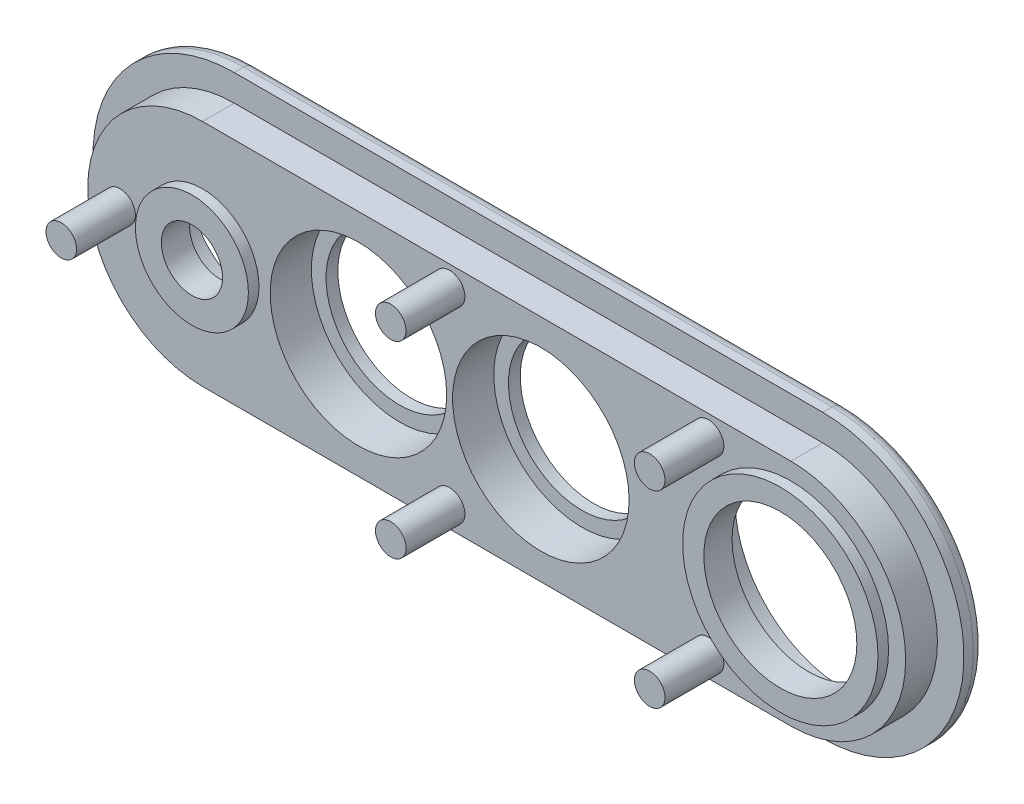
ISO-10303-21;
HEADER;
FILE_DESCRIPTION(('STEP AP214'),'2;1');
FILE_NAME('part.step','',(''),(''),'','','');
FILE_SCHEMA(('AUTOMOTIVE_DESIGN { 1 0 10303 214 1 1 1 1 }'));
ENDSEC;
DATA;
#1=APPLICATION_CONTEXT('core data for automotive mechanical design processes');
#2=APPLICATION_PROTOCOL_DEFINITION('international standard','automotive_design',2000,#1);
#3=PRODUCT_CONTEXT('',#1,'mechanical');
#4=PRODUCT('Part','Part','',(#3));
#5=PRODUCT_RELATED_PRODUCT_CATEGORY('part','',(#4));
#6=PRODUCT_DEFINITION_FORMATION('','',#4);
#7=PRODUCT_DEFINITION_CONTEXT('part definition',#1,'design');
#8=PRODUCT_DEFINITION('design','',#6,#7);
#9=PRODUCT_DEFINITION_SHAPE('','',#8);
#10=(LENGTH_UNIT() NAMED_UNIT(*) SI_UNIT(.MILLI.,.METRE.));
#11=(NAMED_UNIT(*) PLANE_ANGLE_UNIT() SI_UNIT($,.RADIAN.));
#12=(NAMED_UNIT(*) SI_UNIT($,.STERADIAN.) SOLID_ANGLE_UNIT());
#13=UNCERTAINTY_MEASURE_WITH_UNIT(LENGTH_MEASURE(1.E-05),#10,'distance_accuracy_value','');
#14=(GEOMETRIC_REPRESENTATION_CONTEXT(3) GLOBAL_UNCERTAINTY_ASSIGNED_CONTEXT((#13)) GLOBAL_UNIT_ASSIGNED_CONTEXT((#10,
#11,#12)) REPRESENTATION_CONTEXT('',''));
#15=CARTESIAN_POINT('',(0.,0.,0.));
#16=DIRECTION('',(0.,0.,1.));
#17=DIRECTION('',(1.,0.,0.));
#18=AXIS2_PLACEMENT_3D('',#15,#16,#17);
#19=CARTESIAN_POINT('',(0.,-12.,4.5));
#20=DIRECTION('',(0.,0.,1.));
#21=DIRECTION('',(1.,0.,0.));
#22=AXIS2_PLACEMENT_3D('',#19,#20,#21);
#23=PLANE('',#22);
#24=CARTESIAN_POINT('',(0.,-12.,4.5));
#25=DIRECTION('',(0.,0.,1.));
#26=DIRECTION('',(1.,0.,0.));
#27=AXIS2_PLACEMENT_3D('',#24,#25,#26);
#28=CIRCLE('',#27,4.8);
#29=CARTESIAN_POINT('',(4.8,-12.,4.5));
#30=VERTEX_POINT('',#29);
#31=EDGE_CURVE('E390',#30,#30,#28,.T.);
#32=ORIENTED_EDGE('',*,*,#31,.F.);
#33=EDGE_LOOP('',(#32));
#34=FACE_BOUND('',#33,.T.);
#35=CARTESIAN_POINT('',(43.,-20.,4.5));
#36=DIRECTION('',(0.,0.,1.));
#37=DIRECTION('',(1.,0.,0.));
#38=AXIS2_PLACEMENT_3D('',#35,#36,#37);
#39=CIRCLE('',#38,1.3);
#40=CARTESIAN_POINT('',(44.3,-20.,4.5));
#41=VERTEX_POINT('',#40);
#42=EDGE_CURVE('E404',#41,#41,#39,.T.);
#43=ORIENTED_EDGE('',*,*,#42,.F.);
#44=EDGE_LOOP('',(#43));
#45=FACE_BOUND('',#44,.T.);
#46=CARTESIAN_POINT('',(43.,-4.,4.5));
#47=DIRECTION('',(0.,0.,1.));
#48=DIRECTION('',(1.,0.,0.));
#49=AXIS2_PLACEMENT_3D('',#46,#47,#48);
#50=CIRCLE('',#49,1.3);
#51=CARTESIAN_POINT('',(44.3,-4.,4.5));
#52=VERTEX_POINT('',#51);
#53=EDGE_CURVE('E410',#52,#52,#50,.T.);
#54=ORIENTED_EDGE('',*,*,#53,.F.);
#55=EDGE_LOOP('',(#54));
#56=FACE_BOUND('',#55,.T.);
#57=CARTESIAN_POINT('',(-7.,-12.,4.5));
#58=DIRECTION('',(0.,0.,1.));
#59=DIRECTION('',(1.,0.,0.));
#60=AXIS2_PLACEMENT_3D('',#57,#58,#59);
#61=CIRCLE('',#60,1.3);
#62=CARTESIAN_POINT('',(-5.7,-12.,4.5));
#63=VERTEX_POINT('',#62);
#64=EDGE_CURVE('E416',#63,#63,#61,.T.);
#65=ORIENTED_EDGE('',*,*,#64,.F.);
#66=EDGE_LOOP('',(#65));
#67=FACE_BOUND('',#66,.T.);
#68=CARTESIAN_POINT('',(21.,-20.,4.5));
#69=DIRECTION('',(0.,0.,1.));
#70=DIRECTION('',(1.,0.,0.));
#71=AXIS2_PLACEMENT_3D('',#68,#69,#70);
#72=CIRCLE('',#71,1.3);
#73=CARTESIAN_POINT('',(22.3,-20.,4.5));
#74=VERTEX_POINT('',#73);
#75=EDGE_CURVE('E422',#74,#74,#72,.T.);
#76=ORIENTED_EDGE('',*,*,#75,.F.);
#77=EDGE_LOOP('',(#76));
#78=FACE_BOUND('',#77,.T.);
#79=CARTESIAN_POINT('',(21.,-4.,4.5));
#80=DIRECTION('',(0.,0.,1.));
#81=DIRECTION('',(1.,0.,0.));
#82=AXIS2_PLACEMENT_3D('',#79,#80,#81);
#83=CIRCLE('',#82,1.3);
#84=CARTESIAN_POINT('',(22.3,-4.,4.5));
#85=VERTEX_POINT('',#84);
#86=EDGE_CURVE('E230',#85,#85,#83,.T.);
#87=ORIENTED_EDGE('',*,*,#86,.F.);
#88=EDGE_LOOP('',(#87));
#89=FACE_BOUND('',#88,.T.);
#90=CARTESIAN_POINT('',(28.75,-12.,4.5));
#91=DIRECTION('',(0.,0.,1.));
#92=DIRECTION('',(1.,0.,0.));
#93=AXIS2_PLACEMENT_3D('',#90,#91,#92);
#94=CIRCLE('',#93,7.5);
#95=CARTESIAN_POINT('',(36.25,-12.,4.5));
#96=VERTEX_POINT('',#95);
#97=EDGE_CURVE('E222',#96,#96,#94,.T.);
#98=ORIENTED_EDGE('',*,*,#97,.F.);
#99=EDGE_LOOP('',(#98));
#100=FACE_BOUND('',#99,.T.);
#101=CARTESIAN_POINT('',(13.25,-12.,4.5));
#102=DIRECTION('',(0.,0.,1.));
#103=DIRECTION('',(1.,0.,0.));
#104=AXIS2_PLACEMENT_3D('',#101,#102,#103);
#105=CIRCLE('',#104,7.5);
#106=CARTESIAN_POINT('',(20.75,-12.,4.5));
#107=VERTEX_POINT('',#106);
#108=EDGE_CURVE('E227',#107,#107,#105,.T.);
#109=ORIENTED_EDGE('',*,*,#108,.F.);
#110=EDGE_LOOP('',(#109));
#111=FACE_BOUND('',#110,.T.);
#112=DIRECTION('',(-1.,0.,0.));
#113=VECTOR('',#112,1.);
#114=CARTESIAN_POINT('',(0.,-2.25,4.5));
#115=LINE('',#114,#113);
#116=CARTESIAN_POINT('',(50.,-2.25,4.5));
#117=VERTEX_POINT('',#116);
#118=CARTESIAN_POINT('',(0.,-2.25,4.5));
#119=VERTEX_POINT('',#118);
#120=EDGE_CURVE('E145',#117,#119,#115,.T.);
#121=ORIENTED_EDGE('',*,*,#120,.T.);
#122=CARTESIAN_POINT('',(0.,-12.,4.5));
#123=DIRECTION('',(0.,0.,1.));
#124=DIRECTION('',(1.,0.,0.));
#125=AXIS2_PLACEMENT_3D('',#122,#123,#124);
#126=CIRCLE('',#125,9.75);
#127=CARTESIAN_POINT('',(0.,-21.75,4.5));
#128=VERTEX_POINT('',#127);
#129=EDGE_CURVE('E156',#119,#128,#126,.T.);
#130=ORIENTED_EDGE('',*,*,#129,.T.);
#131=DIRECTION('',(1.,0.,0.));
#132=VECTOR('',#131,1.);
#133=CARTESIAN_POINT('',(0.,-21.75,4.5));
#134=LINE('',#133,#132);
#135=CARTESIAN_POINT('',(50.,-21.75,4.5));
#136=VERTEX_POINT('',#135);
#137=EDGE_CURVE('E124',#128,#136,#134,.T.);
#138=ORIENTED_EDGE('',*,*,#137,.T.);
#139=CARTESIAN_POINT('',(50.,-12.,4.5));
#140=DIRECTION('',(0.,0.,1.));
#141=DIRECTION('',(1.,0.,0.));
#142=AXIS2_PLACEMENT_3D('',#139,#140,#141);
#143=CIRCLE('',#142,9.75);
#144=EDGE_CURVE('E148',#136,#117,#143,.T.);
#145=ORIENTED_EDGE('',*,*,#144,.T.);
#146=EDGE_LOOP('',(#121,#130,#138,#145));
#147=FACE_BOUND('',#146,.T.);
#148=CARTESIAN_POINT('',(50.,-12.,4.5));
#149=DIRECTION('',(0.,0.,1.));
#150=DIRECTION('',(1.,0.,0.));
#151=AXIS2_PLACEMENT_3D('',#148,#149,#150);
#152=CIRCLE('',#151,8.3);
#153=CARTESIAN_POINT('',(58.3,-12.,4.5));
#154=VERTEX_POINT('',#153);
#155=EDGE_CURVE('E397',#154,#154,#152,.T.);
#156=ORIENTED_EDGE('',*,*,#155,.F.);
#157=EDGE_LOOP('',(#156));
#158=FACE_BOUND('',#157,.T.);
#159=ADVANCED_FACE('F39',(#34,#45,#56,#67,#78,#89,#100,#111,#147,#158),#23,.T.);
#160=CARTESIAN_POINT('',(13.25,-12.,0.));
#161=DIRECTION('',(0.,0.,1.));
#162=DIRECTION('',(1.,0.,0.));
#163=AXIS2_PLACEMENT_3D('',#160,#161,#162);
#164=CYLINDRICAL_SURFACE('',#163,6.25);
#165=CARTESIAN_POINT('',(13.25,-12.,0.));
#166=DIRECTION('',(0.,0.,1.));
#167=DIRECTION('',(1.,0.,0.));
#168=AXIS2_PLACEMENT_3D('',#165,#166,#167);
#169=CIRCLE('',#168,6.25);
#170=CARTESIAN_POINT('',(19.5,-12.,0.));
#171=VERTEX_POINT('',#170);
#172=EDGE_CURVE('E151',#171,#171,#169,.T.);
#173=ORIENTED_EDGE('',*,*,#172,.F.);
#174=EDGE_LOOP('',(#173));
#175=FACE_BOUND('',#174,.T.);
#176=CARTESIAN_POINT('',(13.25,-12.,1.));
#177=DIRECTION('',(0.,0.,1.));
#178=DIRECTION('',(1.,0.,0.));
#179=AXIS2_PLACEMENT_3D('',#176,#177,#178);
#180=CIRCLE('',#179,6.25);
#181=CARTESIAN_POINT('',(19.5,-12.,1.));
#182=VERTEX_POINT('',#181);
#183=EDGE_CURVE('E43',#182,#182,#180,.F.);
#184=ORIENTED_EDGE('',*,*,#183,.F.);
#185=EDGE_LOOP('',(#184));
#186=FACE_BOUND('',#185,.T.);
#187=ADVANCED_FACE('F256',(#175,#186),#164,.F.);
#188=CARTESIAN_POINT('',(28.75,-12.,0.));
#189=DIRECTION('',(0.,0.,1.));
#190=DIRECTION('',(1.,0.,0.));
#191=AXIS2_PLACEMENT_3D('',#188,#189,#190);
#192=CYLINDRICAL_SURFACE('',#191,6.25);
#193=CARTESIAN_POINT('',(28.75,-12.,0.));
#194=DIRECTION('',(0.,0.,1.));
#195=DIRECTION('',(1.,0.,0.));
#196=AXIS2_PLACEMENT_3D('',#193,#194,#195);
#197=CIRCLE('',#196,6.25);
#198=CARTESIAN_POINT('',(35.,-12.,0.));
#199=VERTEX_POINT('',#198);
#200=EDGE_CURVE('E190',#199,#199,#197,.T.);
#201=ORIENTED_EDGE('',*,*,#200,.F.);
#202=EDGE_LOOP('',(#201));
#203=FACE_BOUND('',#202,.T.);
#204=CARTESIAN_POINT('',(28.75,-12.,1.));
#205=DIRECTION('',(0.,0.,1.));
#206=DIRECTION('',(1.,0.,0.));
#207=AXIS2_PLACEMENT_3D('',#204,#205,#206);
#208=CIRCLE('',#207,6.25);
#209=CARTESIAN_POINT('',(35.,-12.,1.));
#210=VERTEX_POINT('',#209);
#211=EDGE_CURVE('E215',#210,#210,#208,.F.);
#212=ORIENTED_EDGE('',*,*,#211,.F.);
#213=EDGE_LOOP('',(#212));
#214=FACE_BOUND('',#213,.T.);
#215=ADVANCED_FACE('F259',(#203,#214),#192,.F.);
#216=CARTESIAN_POINT('',(50.,-12.,0.));
#217=DIRECTION('',(0.,0.,1.));
#218=DIRECTION('',(1.,0.,0.));
#219=AXIS2_PLACEMENT_3D('',#216,#217,#218);
#220=CYLINDRICAL_SURFACE('',#219,6.5);
#221=CARTESIAN_POINT('',(50.,-12.,3.));
#222=DIRECTION('',(0.,0.,-1.));
#223=DIRECTION('',(-1.,0.,0.));
#224=AXIS2_PLACEMENT_3D('',#221,#222,#223);
#225=CIRCLE('',#224,6.5);
#226=CARTESIAN_POINT('',(43.5,-12.,3.));
#227=VERTEX_POINT('',#226);
#228=EDGE_CURVE('E186',#227,#227,#225,.F.);
#229=ORIENTED_EDGE('',*,*,#228,.F.);
#230=EDGE_LOOP('',(#229));
#231=FACE_BOUND('',#230,.T.);
#232=CARTESIAN_POINT('',(50.,-12.,5.4));
#233=DIRECTION('',(0.,0.,1.));
#234=DIRECTION('',(1.,0.,0.));
#235=AXIS2_PLACEMENT_3D('',#232,#233,#234);
#236=CIRCLE('',#235,6.5);
#237=CARTESIAN_POINT('',(56.5,-12.,5.4));
#238=VERTEX_POINT('',#237);
#239=EDGE_CURVE('E391',#238,#238,#236,.T.);
#240=ORIENTED_EDGE('',*,*,#239,.T.);
#241=EDGE_LOOP('',(#240));
#242=FACE_BOUND('',#241,.T.);
#243=ADVANCED_FACE('F358',(#231,#242),#220,.F.);
#244=CARTESIAN_POINT('',(0.,-12.,0.));
#245=DIRECTION('',(0.,0.,1.));
#246=DIRECTION('',(1.,0.,0.));
#247=AXIS2_PLACEMENT_3D('',#244,#245,#246);
#248=CYLINDRICAL_SURFACE('',#247,2.6);
#249=CARTESIAN_POINT('',(0.,-12.,3.));
#250=DIRECTION('',(0.,0.,-1.));
#251=DIRECTION('',(-1.,0.,0.));
#252=AXIS2_PLACEMENT_3D('',#249,#250,#251);
#253=CIRCLE('',#252,2.6);
#254=CARTESIAN_POINT('',(-2.6,-12.,3.));
#255=VERTEX_POINT('',#254);
#256=EDGE_CURVE('E183',#255,#255,#253,.F.);
#257=ORIENTED_EDGE('',*,*,#256,.F.);
#258=EDGE_LOOP('',(#257));
#259=FACE_BOUND('',#258,.T.);
#260=CARTESIAN_POINT('',(0.,-12.,5.4));
#261=DIRECTION('',(0.,0.,1.));
#262=DIRECTION('',(1.,0.,0.));
#263=AXIS2_PLACEMENT_3D('',#260,#261,#262);
#264=CIRCLE('',#263,2.6);
#265=CARTESIAN_POINT('',(2.6,-12.,5.4));
#266=VERTEX_POINT('',#265);
#267=EDGE_CURVE('E388',#266,#266,#264,.T.);
#268=ORIENTED_EDGE('',*,*,#267,.T.);
#269=EDGE_LOOP('',(#268));
#270=FACE_BOUND('',#269,.T.);
#271=ADVANCED_FACE('F307',(#259,#270),#248,.F.);
#272=CARTESIAN_POINT('',(0.,-12.,4.5));
#273=DIRECTION('',(0.,0.,-1.));
#274=DIRECTION('',(-1.,0.,0.));
#275=AXIS2_PLACEMENT_3D('',#272,#273,#274);
#276=CYLINDRICAL_SURFACE('',#275,12.);
#277=DIRECTION('',(0.,0.,-1.));
#278=VECTOR('',#277,1.);
#279=CARTESIAN_POINT('',(0.,0.,4.5));
#280=LINE('',#279,#278);
#281=CARTESIAN_POINT('',(0.,0.,1.8));
#282=VERTEX_POINT('',#281);
#283=CARTESIAN_POINT('',(0.,0.,1.));
#284=VERTEX_POINT('',#283);
#285=EDGE_CURVE('E171',#282,#284,#280,.T.);
#286=ORIENTED_EDGE('',*,*,#285,.T.);
#287=CARTESIAN_POINT('',(0.,-12.,1.));
#288=DIRECTION('',(0.,0.,1.));
#289=DIRECTION('',(1.,0.,0.));
#290=AXIS2_PLACEMENT_3D('',#287,#288,#289);
#291=CIRCLE('',#290,12.);
#292=CARTESIAN_POINT('',(0.,-24.,1.));
#293=VERTEX_POINT('',#292);
#294=EDGE_CURVE('E48',#284,#293,#291,.T.);
#295=ORIENTED_EDGE('',*,*,#294,.T.);
#296=DIRECTION('',(0.,0.,-1.));
#297=VECTOR('',#296,1.);
#298=CARTESIAN_POINT('',(0.,-24.,4.5));
#299=LINE('',#298,#297);
#300=CARTESIAN_POINT('',(0.,-24.,1.8));
#301=VERTEX_POINT('',#300);
#302=EDGE_CURVE('E178',#301,#293,#299,.T.);
#303=ORIENTED_EDGE('',*,*,#302,.F.);
#304=CARTESIAN_POINT('',(0.,-12.,1.8));
#305=DIRECTION('',(0.,0.,1.));
#306=DIRECTION('',(1.,0.,0.));
#307=AXIS2_PLACEMENT_3D('',#304,#305,#306);
#308=CIRCLE('',#307,12.);
#309=EDGE_CURVE('E169',#282,#301,#308,.T.);
#310=ORIENTED_EDGE('',*,*,#309,.F.);
#311=EDGE_LOOP('',(#286,#295,#303,#310));
#312=FACE_BOUND('',#311,.T.);
#313=ADVANCED_FACE('F303',(#312),#276,.T.);
#314=CARTESIAN_POINT('',(0.,-24.,4.5));
#315=DIRECTION('',(0.,1.,0.));
#316=DIRECTION('',(0.,0.,1.));
#317=AXIS2_PLACEMENT_3D('',#314,#315,#316);
#318=PLANE('',#317);
#319=ORIENTED_EDGE('',*,*,#302,.T.);
#320=DIRECTION('',(1.,0.,0.));
#321=VECTOR('',#320,1.);
#322=CARTESIAN_POINT('',(0.,-24.,1.));
#323=LINE('',#322,#321);
#324=CARTESIAN_POINT('',(50.,-24.,1.));
#325=VERTEX_POINT('',#324);
#326=EDGE_CURVE('E202',#293,#325,#323,.T.);
#327=ORIENTED_EDGE('',*,*,#326,.T.);
#328=DIRECTION('',(0.,0.,-1.));
#329=VECTOR('',#328,1.);
#330=CARTESIAN_POINT('',(50.,-24.,4.5));
#331=LINE('',#330,#329);
#332=CARTESIAN_POINT('',(50.,-24.,1.8));
#333=VERTEX_POINT('',#332);
#334=EDGE_CURVE('E175',#333,#325,#331,.T.);
#335=ORIENTED_EDGE('',*,*,#334,.F.);
#336=DIRECTION('',(1.,0.,0.));
#337=VECTOR('',#336,1.);
#338=CARTESIAN_POINT('',(0.,-24.,1.8));
#339=LINE('',#338,#337);
#340=EDGE_CURVE('E167',#301,#333,#339,.T.);
#341=ORIENTED_EDGE('',*,*,#340,.F.);
#342=EDGE_LOOP('',(#319,#327,#335,#341));
#343=FACE_BOUND('',#342,.T.);
#344=ADVANCED_FACE('F299',(#343),#318,.F.);
#345=CARTESIAN_POINT('',(50.,-12.,4.5));
#346=DIRECTION('',(0.,0.,-1.));
#347=DIRECTION('',(-1.,0.,0.));
#348=AXIS2_PLACEMENT_3D('',#345,#346,#347);
#349=CYLINDRICAL_SURFACE('',#348,12.);
#350=ORIENTED_EDGE('',*,*,#334,.T.);
#351=CARTESIAN_POINT('',(50.,-12.,1.));
#352=DIRECTION('',(0.,0.,1.));
#353=DIRECTION('',(1.,0.,0.));
#354=AXIS2_PLACEMENT_3D('',#351,#352,#353);
#355=CIRCLE('',#354,12.);
#356=CARTESIAN_POINT('',(50.,0.,1.));
#357=VERTEX_POINT('',#356);
#358=EDGE_CURVE('E182',#325,#357,#355,.T.);
#359=ORIENTED_EDGE('',*,*,#358,.T.);
#360=DIRECTION('',(0.,0.,-1.));
#361=VECTOR('',#360,1.);
#362=CARTESIAN_POINT('',(50.,0.,4.5));
#363=LINE('',#362,#361);
#364=CARTESIAN_POINT('',(50.,0.,1.8));
#365=VERTEX_POINT('',#364);
#366=EDGE_CURVE('E173',#365,#357,#363,.T.);
#367=ORIENTED_EDGE('',*,*,#366,.F.);
#368=CARTESIAN_POINT('',(50.,-12.,1.8));
#369=DIRECTION('',(0.,0.,1.));
#370=DIRECTION('',(1.,0.,0.));
#371=AXIS2_PLACEMENT_3D('',#368,#369,#370);
#372=CIRCLE('',#371,12.);
#373=EDGE_CURVE('E162',#333,#365,#372,.T.);
#374=ORIENTED_EDGE('',*,*,#373,.F.);
#375=EDGE_LOOP('',(#350,#359,#367,#374));
#376=FACE_BOUND('',#375,.T.);
#377=ADVANCED_FACE('F296',(#376),#349,.T.);
#378=CARTESIAN_POINT('',(0.,0.,4.5));
#379=DIRECTION('',(0.,-1.,0.));
#380=DIRECTION('',(0.,0.,-1.));
#381=AXIS2_PLACEMENT_3D('',#378,#379,#380);
#382=PLANE('',#381);
#383=ORIENTED_EDGE('',*,*,#366,.T.);
#384=DIRECTION('',(-1.,0.,0.));
#385=VECTOR('',#384,1.);
#386=CARTESIAN_POINT('',(0.,0.,1.));
#387=LINE('',#386,#385);
#388=EDGE_CURVE('E11',#357,#284,#387,.T.);
#389=ORIENTED_EDGE('',*,*,#388,.T.);
#390=ORIENTED_EDGE('',*,*,#285,.F.);
#391=DIRECTION('',(-1.,0.,0.));
#392=VECTOR('',#391,1.);
#393=CARTESIAN_POINT('',(0.,0.,1.8));
#394=LINE('',#393,#392);
#395=EDGE_CURVE('E180',#365,#282,#394,.T.);
#396=ORIENTED_EDGE('',*,*,#395,.F.);
#397=EDGE_LOOP('',(#383,#389,#390,#396));
#398=FACE_BOUND('',#397,.T.);
#399=ADVANCED_FACE('F292',(#398),#382,.F.);
#400=CARTESIAN_POINT('',(0.,-12.,0.));
#401=DIRECTION('',(0.,0.,1.));
#402=DIRECTION('',(1.,0.,0.));
#403=AXIS2_PLACEMENT_3D('',#400,#401,#402);
#404=PLANE('',#403);
#405=DIRECTION('',(-1.,0.,0.));
#406=VECTOR('',#405,1.);
#407=CARTESIAN_POINT('',(0.,-1.,0.));
#408=LINE('',#407,#406);
#409=CARTESIAN_POINT('',(0.,-1.,0.));
#410=VERTEX_POINT('',#409);
#411=CARTESIAN_POINT('',(50.,-1.,0.));
#412=VERTEX_POINT('',#411);
#413=EDGE_CURVE('E193',#410,#412,#408,.F.);
#414=ORIENTED_EDGE('',*,*,#413,.T.);
#415=CARTESIAN_POINT('',(50.,-12.,0.));
#416=DIRECTION('',(0.,0.,1.));
#417=DIRECTION('',(1.,0.,0.));
#418=AXIS2_PLACEMENT_3D('',#415,#416,#417);
#419=CIRCLE('',#418,11.);
#420=CARTESIAN_POINT('',(50.,-23.,0.));
#421=VERTEX_POINT('',#420);
#422=EDGE_CURVE('E199',#412,#421,#419,.F.);
#423=ORIENTED_EDGE('',*,*,#422,.T.);
#424=DIRECTION('',(1.,0.,0.));
#425=VECTOR('',#424,1.);
#426=CARTESIAN_POINT('',(0.,-23.,0.));
#427=LINE('',#426,#425);
#428=CARTESIAN_POINT('',(0.,-23.,0.));
#429=VERTEX_POINT('',#428);
#430=EDGE_CURVE('E197',#421,#429,#427,.F.);
#431=ORIENTED_EDGE('',*,*,#430,.T.);
#432=CARTESIAN_POINT('',(0.,-12.,0.));
#433=DIRECTION('',(0.,0.,1.));
#434=DIRECTION('',(1.,0.,0.));
#435=AXIS2_PLACEMENT_3D('',#432,#433,#434);
#436=CIRCLE('',#435,11.);
#437=EDGE_CURVE('E195',#429,#410,#436,.F.);
#438=ORIENTED_EDGE('',*,*,#437,.T.);
#439=EDGE_LOOP('',(#414,#423,#431,#438));
#440=FACE_BOUND('',#439,.T.);
#441=CARTESIAN_POINT('',(0.,-12.,0.));
#442=DIRECTION('',(0.,0.,-1.));
#443=DIRECTION('',(-1.,0.,0.));
#444=AXIS2_PLACEMENT_3D('',#441,#442,#443);
#445=CIRCLE('',#444,5.5);
#446=CARTESIAN_POINT('',(-5.5,-12.,0.));
#447=VERTEX_POINT('',#446);
#448=EDGE_CURVE('E241',#447,#447,#445,.T.);
#449=ORIENTED_EDGE('',*,*,#448,.F.);
#450=EDGE_LOOP('',(#449));
#451=FACE_BOUND('',#450,.T.);
#452=CARTESIAN_POINT('',(50.,-12.,0.));
#453=DIRECTION('',(0.,0.,-1.));
#454=DIRECTION('',(-1.,0.,0.));
#455=AXIS2_PLACEMENT_3D('',#452,#453,#454);
#456=CIRCLE('',#455,9.25);
#457=CARTESIAN_POINT('',(40.75,-12.,0.));
#458=VERTEX_POINT('',#457);
#459=EDGE_CURVE('E244',#458,#458,#456,.T.);
#460=ORIENTED_EDGE('',*,*,#459,.F.);
#461=EDGE_LOOP('',(#460));
#462=FACE_BOUND('',#461,.T.);
#463=ORIENTED_EDGE('',*,*,#200,.T.);
#464=EDGE_LOOP('',(#463));
#465=FACE_BOUND('',#464,.T.);
#466=ORIENTED_EDGE('',*,*,#172,.T.);
#467=EDGE_LOOP('',(#466));
#468=FACE_BOUND('',#467,.T.);
#469=ADVANCED_FACE('F254',(#440,#451,#462,#465,#468),#404,.F.);
#470=CARTESIAN_POINT('',(0.,-12.,1.8));
#471=DIRECTION('',(0.,0.,1.));
#472=DIRECTION('',(1.,0.,0.));
#473=AXIS2_PLACEMENT_3D('',#470,#471,#472);
#474=PLANE('',#473);
#475=DIRECTION('',(-1.,0.,0.));
#476=VECTOR('',#475,1.);
#477=CARTESIAN_POINT('',(0.,-2.25,1.8));
#478=LINE('',#477,#476);
#479=CARTESIAN_POINT('',(50.,-2.25,1.8));
#480=VERTEX_POINT('',#479);
#481=CARTESIAN_POINT('',(0.,-2.25,1.8));
#482=VERTEX_POINT('',#481);
#483=EDGE_CURVE('E130',#480,#482,#478,.T.);
#484=ORIENTED_EDGE('',*,*,#483,.F.);
#485=CARTESIAN_POINT('',(50.,-12.,1.8));
#486=DIRECTION('',(0.,0.,1.));
#487=DIRECTION('',(1.,0.,0.));
#488=AXIS2_PLACEMENT_3D('',#485,#486,#487);
#489=CIRCLE('',#488,9.75);
#490=CARTESIAN_POINT('',(50.,-21.75,1.8));
#491=VERTEX_POINT('',#490);
#492=EDGE_CURVE('E140',#491,#480,#489,.T.);
#493=ORIENTED_EDGE('',*,*,#492,.F.);
#494=DIRECTION('',(1.,0.,0.));
#495=VECTOR('',#494,1.);
#496=CARTESIAN_POINT('',(0.,-21.75,1.8));
#497=LINE('',#496,#495);
#498=CARTESIAN_POINT('',(0.,-21.75,1.8));
#499=VERTEX_POINT('',#498);
#500=EDGE_CURVE('E122',#499,#491,#497,.T.);
#501=ORIENTED_EDGE('',*,*,#500,.F.);
#502=CARTESIAN_POINT('',(0.,-12.,1.8));
#503=DIRECTION('',(0.,0.,1.));
#504=DIRECTION('',(1.,0.,0.));
#505=AXIS2_PLACEMENT_3D('',#502,#503,#504);
#506=CIRCLE('',#505,9.75);
#507=EDGE_CURVE('E137',#482,#499,#506,.T.);
#508=ORIENTED_EDGE('',*,*,#507,.F.);
#509=EDGE_LOOP('',(#484,#493,#501,#508));
#510=FACE_BOUND('',#509,.T.);
#511=ORIENTED_EDGE('',*,*,#309,.T.);
#512=ORIENTED_EDGE('',*,*,#340,.T.);
#513=ORIENTED_EDGE('',*,*,#373,.T.);
#514=ORIENTED_EDGE('',*,*,#395,.T.);
#515=EDGE_LOOP('',(#511,#512,#513,#514));
#516=FACE_BOUND('',#515,.T.);
#517=ADVANCED_FACE('F135',(#510,#516),#474,.T.);
#518=CARTESIAN_POINT('',(0.,-12.,1.8));
#519=DIRECTION('',(0.,0.,1.));
#520=DIRECTION('',(1.,0.,0.));
#521=AXIS2_PLACEMENT_3D('',#518,#519,#520);
#522=CYLINDRICAL_SURFACE('',#521,9.75);
#523=ORIENTED_EDGE('',*,*,#129,.F.);
#524=DIRECTION('',(0.,0.,1.));
#525=VECTOR('',#524,1.);
#526=CARTESIAN_POINT('',(0.,-2.25,1.8));
#527=LINE('',#526,#525);
#528=EDGE_CURVE('E144',#482,#119,#527,.T.);
#529=ORIENTED_EDGE('',*,*,#528,.F.);
#530=ORIENTED_EDGE('',*,*,#507,.T.);
#531=DIRECTION('',(0.,0.,1.));
#532=VECTOR('',#531,1.);
#533=CARTESIAN_POINT('',(0.,-21.75,1.8));
#534=LINE('',#533,#532);
#535=EDGE_CURVE('E118',#499,#128,#534,.T.);
#536=ORIENTED_EDGE('',*,*,#535,.T.);
#537=EDGE_LOOP('',(#523,#529,#530,#536));
#538=FACE_BOUND('',#537,.T.);
#539=ADVANCED_FACE('F143',(#538),#522,.T.);
#540=CARTESIAN_POINT('',(0.,-2.25,1.8));
#541=DIRECTION('',(0.,1.,0.));
#542=DIRECTION('',(0.,0.,1.));
#543=AXIS2_PLACEMENT_3D('',#540,#541,#542);
#544=PLANE('',#543);
#545=ORIENTED_EDGE('',*,*,#120,.F.);
#546=DIRECTION('',(0.,0.,1.));
#547=VECTOR('',#546,1.);
#548=CARTESIAN_POINT('',(50.,-2.25,1.8));
#549=LINE('',#548,#547);
#550=EDGE_CURVE('E163',#480,#117,#549,.T.);
#551=ORIENTED_EDGE('',*,*,#550,.F.);
#552=ORIENTED_EDGE('',*,*,#483,.T.);
#553=ORIENTED_EDGE('',*,*,#528,.T.);
#554=EDGE_LOOP('',(#545,#551,#552,#553));
#555=FACE_BOUND('',#554,.T.);
#556=ADVANCED_FACE('F344',(#555),#544,.T.);
#557=CARTESIAN_POINT('',(50.,-12.,1.8));
#558=DIRECTION('',(0.,0.,1.));
#559=DIRECTION('',(1.,0.,0.));
#560=AXIS2_PLACEMENT_3D('',#557,#558,#559);
#561=CYLINDRICAL_SURFACE('',#560,9.75);
#562=ORIENTED_EDGE('',*,*,#144,.F.);
#563=DIRECTION('',(0.,0.,1.));
#564=VECTOR('',#563,1.);
#565=CARTESIAN_POINT('',(50.,-21.75,1.8));
#566=LINE('',#565,#564);
#567=EDGE_CURVE('E129',#491,#136,#566,.T.);
#568=ORIENTED_EDGE('',*,*,#567,.F.);
#569=ORIENTED_EDGE('',*,*,#492,.T.);
#570=ORIENTED_EDGE('',*,*,#550,.T.);
#571=EDGE_LOOP('',(#562,#568,#569,#570));
#572=FACE_BOUND('',#571,.T.);
#573=ADVANCED_FACE('F348',(#572),#561,.T.);
#574=CARTESIAN_POINT('',(0.,-21.75,1.8));
#575=DIRECTION('',(0.,-1.,0.));
#576=DIRECTION('',(0.,0.,-1.));
#577=AXIS2_PLACEMENT_3D('',#574,#575,#576);
#578=PLANE('',#577);
#579=ORIENTED_EDGE('',*,*,#137,.F.);
#580=ORIENTED_EDGE('',*,*,#535,.F.);
#581=ORIENTED_EDGE('',*,*,#500,.T.);
#582=ORIENTED_EDGE('',*,*,#567,.T.);
#583=EDGE_LOOP('',(#579,#580,#581,#582));
#584=FACE_BOUND('',#583,.T.);
#585=ADVANCED_FACE('F120',(#584),#578,.T.);
#586=CARTESIAN_POINT('',(0.,-12.,3.));
#587=DIRECTION('',(0.,0.,-1.));
#588=DIRECTION('',(-1.,0.,0.));
#589=AXIS2_PLACEMENT_3D('',#586,#587,#588);
#590=PLANE('',#589);
#591=CARTESIAN_POINT('',(0.,-12.,3.));
#592=DIRECTION('',(0.,0.,-1.));
#593=DIRECTION('',(-1.,0.,0.));
#594=AXIS2_PLACEMENT_3D('',#591,#592,#593);
#595=CIRCLE('',#594,5.5);
#596=CARTESIAN_POINT('',(-5.5,-12.,3.));
#597=VERTEX_POINT('',#596);
#598=EDGE_CURVE('E187',#597,#597,#595,.T.);
#599=ORIENTED_EDGE('',*,*,#598,.T.);
#600=EDGE_LOOP('',(#599));
#601=FACE_BOUND('',#600,.T.);
#602=ORIENTED_EDGE('',*,*,#256,.T.);
#603=EDGE_LOOP('',(#602));
#604=FACE_BOUND('',#603,.T.);
#605=ADVANCED_FACE('F354',(#601,#604),#590,.T.);
#606=CARTESIAN_POINT('',(0.,-12.,3.));
#607=DIRECTION('',(0.,0.,-1.));
#608=DIRECTION('',(-1.,0.,0.));
#609=AXIS2_PLACEMENT_3D('',#606,#607,#608);
#610=CYLINDRICAL_SURFACE('',#609,5.5);
#611=ORIENTED_EDGE('',*,*,#598,.F.);
#612=EDGE_LOOP('',(#611));
#613=FACE_BOUND('',#612,.T.);
#614=ORIENTED_EDGE('',*,*,#448,.T.);
#615=EDGE_LOOP('',(#614));
#616=FACE_BOUND('',#615,.T.);
#617=ADVANCED_FACE('F371',(#613,#616),#610,.F.);
#618=CARTESIAN_POINT('',(50.,-12.,3.));
#619=DIRECTION('',(0.,0.,-1.));
#620=DIRECTION('',(-1.,0.,0.));
#621=AXIS2_PLACEMENT_3D('',#618,#619,#620);
#622=PLANE('',#621);
#623=CARTESIAN_POINT('',(50.,-12.,3.));
#624=DIRECTION('',(0.,0.,-1.));
#625=DIRECTION('',(-1.,0.,0.));
#626=AXIS2_PLACEMENT_3D('',#623,#624,#625);
#627=CIRCLE('',#626,9.25);
#628=CARTESIAN_POINT('',(40.75,-12.,3.));
#629=VERTEX_POINT('',#628);
#630=EDGE_CURVE('E214',#629,#629,#627,.T.);
#631=ORIENTED_EDGE('',*,*,#630,.T.);
#632=EDGE_LOOP('',(#631));
#633=FACE_BOUND('',#632,.T.);
#634=ORIENTED_EDGE('',*,*,#228,.T.);
#635=EDGE_LOOP('',(#634));
#636=FACE_BOUND('',#635,.T.);
#637=ADVANCED_FACE('F368',(#633,#636),#622,.T.);
#638=CARTESIAN_POINT('',(50.,-12.,3.));
#639=DIRECTION('',(0.,0.,-1.));
#640=DIRECTION('',(-1.,0.,0.));
#641=AXIS2_PLACEMENT_3D('',#638,#639,#640);
#642=CYLINDRICAL_SURFACE('',#641,9.25);
#643=ORIENTED_EDGE('',*,*,#630,.F.);
#644=EDGE_LOOP('',(#643));
#645=FACE_BOUND('',#644,.T.);
#646=ORIENTED_EDGE('',*,*,#459,.T.);
#647=EDGE_LOOP('',(#646));
#648=FACE_BOUND('',#647,.T.);
#649=ADVANCED_FACE('F321',(#645,#648),#642,.F.);
#650=CARTESIAN_POINT('',(0.,-12.,1.));
#651=DIRECTION('',(0.,0.,1.));
#652=DIRECTION('',(1.,0.,0.));
#653=AXIS2_PLACEMENT_3D('',#650,#651,#652);
#654=TOROIDAL_SURFACE('',#653,11.,1.);
#655=CARTESIAN_POINT('',(0.,-1.,1.));
#656=DIRECTION('',(1.,0.,0.));
#657=DIRECTION('',(0.,0.,-1.));
#658=AXIS2_PLACEMENT_3D('',#655,#656,#657);
#659=CIRCLE('',#658,1.);
#660=EDGE_CURVE('E209',#410,#284,#659,.T.);
#661=ORIENTED_EDGE('',*,*,#660,.F.);
#662=ORIENTED_EDGE('',*,*,#437,.F.);
#663=CARTESIAN_POINT('',(0.,-23.,1.));
#664=DIRECTION('',(1.,0.,0.));
#665=DIRECTION('',(0.,0.,-1.));
#666=AXIS2_PLACEMENT_3D('',#663,#664,#665);
#667=CIRCLE('',#666,1.);
#668=EDGE_CURVE('E212',#293,#429,#667,.T.);
#669=ORIENTED_EDGE('',*,*,#668,.F.);
#670=ORIENTED_EDGE('',*,*,#294,.F.);
#671=EDGE_LOOP('',(#661,#662,#669,#670));
#672=FACE_BOUND('',#671,.T.);
#673=ADVANCED_FACE('F41',(#672),#654,.T.);
#674=CARTESIAN_POINT('',(0.,-23.,1.));
#675=DIRECTION('',(1.,0.,0.));
#676=DIRECTION('',(0.,0.,-1.));
#677=AXIS2_PLACEMENT_3D('',#674,#675,#676);
#678=CYLINDRICAL_SURFACE('',#677,1.);
#679=ORIENTED_EDGE('',*,*,#668,.T.);
#680=ORIENTED_EDGE('',*,*,#430,.F.);
#681=CARTESIAN_POINT('',(50.,-23.,1.));
#682=DIRECTION('',(1.,0.,0.));
#683=DIRECTION('',(0.,0.,-1.));
#684=AXIS2_PLACEMENT_3D('',#681,#682,#683);
#685=CIRCLE('',#684,1.);
#686=EDGE_CURVE('E207',#325,#421,#685,.T.);
#687=ORIENTED_EDGE('',*,*,#686,.F.);
#688=ORIENTED_EDGE('',*,*,#326,.F.);
#689=EDGE_LOOP('',(#679,#680,#687,#688));
#690=FACE_BOUND('',#689,.T.);
#691=ADVANCED_FACE('F314',(#690),#678,.T.);
#692=CARTESIAN_POINT('',(0.,-1.,1.));
#693=DIRECTION('',(-1.,0.,0.));
#694=DIRECTION('',(0.,0.,1.));
#695=AXIS2_PLACEMENT_3D('',#692,#693,#694);
#696=CYLINDRICAL_SURFACE('',#695,1.);
#697=ORIENTED_EDGE('',*,*,#660,.T.);
#698=ORIENTED_EDGE('',*,*,#388,.F.);
#699=CARTESIAN_POINT('',(50.,-1.,1.));
#700=DIRECTION('',(1.,0.,0.));
#701=DIRECTION('',(0.,0.,-1.));
#702=AXIS2_PLACEMENT_3D('',#699,#700,#701);
#703=CIRCLE('',#702,1.);
#704=EDGE_CURVE('E205',#412,#357,#703,.T.);
#705=ORIENTED_EDGE('',*,*,#704,.F.);
#706=ORIENTED_EDGE('',*,*,#413,.F.);
#707=EDGE_LOOP('',(#697,#698,#705,#706));
#708=FACE_BOUND('',#707,.T.);
#709=ADVANCED_FACE('F311',(#708),#696,.T.);
#710=CARTESIAN_POINT('',(50.,-12.,1.));
#711=DIRECTION('',(0.,0.,1.));
#712=DIRECTION('',(1.,0.,0.));
#713=AXIS2_PLACEMENT_3D('',#710,#711,#712);
#714=TOROIDAL_SURFACE('',#713,11.,1.);
#715=ORIENTED_EDGE('',*,*,#686,.T.);
#716=ORIENTED_EDGE('',*,*,#422,.F.);
#717=ORIENTED_EDGE('',*,*,#704,.T.);
#718=ORIENTED_EDGE('',*,*,#358,.F.);
#719=EDGE_LOOP('',(#715,#716,#717,#718));
#720=FACE_BOUND('',#719,.T.);
#721=ADVANCED_FACE('F308',(#720),#714,.T.);
#722=CARTESIAN_POINT('',(28.75,-12.,1.));
#723=DIRECTION('',(0.,0.,1.));
#724=DIRECTION('',(1.,0.,0.));
#725=AXIS2_PLACEMENT_3D('',#722,#723,#724);
#726=PLANE('',#725);
#727=CARTESIAN_POINT('',(28.75,-12.,1.));
#728=DIRECTION('',(0.,0.,1.));
#729=DIRECTION('',(1.,0.,0.));
#730=AXIS2_PLACEMENT_3D('',#727,#728,#729);
#731=CIRCLE('',#730,7.5);
#732=CARTESIAN_POINT('',(36.25,-12.,1.));
#733=VERTEX_POINT('',#732);
#734=EDGE_CURVE('E217',#733,#733,#731,.T.);
#735=ORIENTED_EDGE('',*,*,#734,.T.);
#736=EDGE_LOOP('',(#735));
#737=FACE_BOUND('',#736,.T.);
#738=ORIENTED_EDGE('',*,*,#211,.T.);
#739=EDGE_LOOP('',(#738));
#740=FACE_BOUND('',#739,.T.);
#741=ADVANCED_FACE('F276',(#737,#740),#726,.T.);
#742=CARTESIAN_POINT('',(28.75,-12.,1.));
#743=DIRECTION('',(0.,0.,1.));
#744=DIRECTION('',(1.,0.,0.));
#745=AXIS2_PLACEMENT_3D('',#742,#743,#744);
#746=CYLINDRICAL_SURFACE('',#745,7.5);
#747=ORIENTED_EDGE('',*,*,#734,.F.);
#748=EDGE_LOOP('',(#747));
#749=FACE_BOUND('',#748,.T.);
#750=ORIENTED_EDGE('',*,*,#97,.T.);
#751=EDGE_LOOP('',(#750));
#752=FACE_BOUND('',#751,.T.);
#753=ADVANCED_FACE('F266',(#749,#752),#746,.F.);
#754=CARTESIAN_POINT('',(13.25,-12.,1.));
#755=DIRECTION('',(0.,0.,1.));
#756=DIRECTION('',(1.,0.,0.));
#757=AXIS2_PLACEMENT_3D('',#754,#755,#756);
#758=PLANE('',#757);
#759=CARTESIAN_POINT('',(13.25,-12.,1.));
#760=DIRECTION('',(0.,0.,1.));
#761=DIRECTION('',(1.,0.,0.));
#762=AXIS2_PLACEMENT_3D('',#759,#760,#761);
#763=CIRCLE('',#762,7.5);
#764=CARTESIAN_POINT('',(20.75,-12.,1.));
#765=VERTEX_POINT('',#764);
#766=EDGE_CURVE('E235',#765,#765,#763,.T.);
#767=ORIENTED_EDGE('',*,*,#766,.T.);
#768=EDGE_LOOP('',(#767));
#769=FACE_BOUND('',#768,.T.);
#770=ORIENTED_EDGE('',*,*,#183,.T.);
#771=EDGE_LOOP('',(#770));
#772=FACE_BOUND('',#771,.T.);
#773=ADVANCED_FACE('F263',(#769,#772),#758,.T.);
#774=CARTESIAN_POINT('',(13.25,-12.,1.));
#775=DIRECTION('',(0.,0.,1.));
#776=DIRECTION('',(1.,0.,0.));
#777=AXIS2_PLACEMENT_3D('',#774,#775,#776);
#778=CYLINDRICAL_SURFACE('',#777,7.5);
#779=ORIENTED_EDGE('',*,*,#766,.F.);
#780=EDGE_LOOP('',(#779));
#781=FACE_BOUND('',#780,.T.);
#782=ORIENTED_EDGE('',*,*,#108,.T.);
#783=EDGE_LOOP('',(#782));
#784=FACE_BOUND('',#783,.T.);
#785=ADVANCED_FACE('F265',(#781,#784),#778,.F.);
#786=CARTESIAN_POINT('',(21.,-4.,9.5));
#787=DIRECTION('',(0.,0.,-1.));
#788=DIRECTION('',(-1.,0.,0.));
#789=AXIS2_PLACEMENT_3D('',#786,#787,#788);
#790=CYLINDRICAL_SURFACE('',#789,1.3);
#791=CARTESIAN_POINT('',(21.,-4.,9.5));
#792=DIRECTION('',(0.,0.,1.));
#793=DIRECTION('',(1.,0.,0.));
#794=AXIS2_PLACEMENT_3D('',#791,#792,#793);
#795=CIRCLE('',#794,1.3);
#796=CARTESIAN_POINT('',(22.3,-4.,9.5));
#797=VERTEX_POINT('',#796);
#798=EDGE_CURVE('E238',#797,#797,#795,.T.);
#799=ORIENTED_EDGE('',*,*,#798,.F.);
#800=EDGE_LOOP('',(#799));
#801=FACE_BOUND('',#800,.T.);
#802=ORIENTED_EDGE('',*,*,#86,.T.);
#803=EDGE_LOOP('',(#802));
#804=FACE_BOUND('',#803,.T.);
#805=ADVANCED_FACE('F273',(#801,#804),#790,.T.);
#806=CARTESIAN_POINT('',(21.,-4.,9.5));
#807=DIRECTION('',(0.,0.,1.));
#808=DIRECTION('',(1.,0.,0.));
#809=AXIS2_PLACEMENT_3D('',#806,#807,#808);
#810=PLANE('',#809);
#811=ORIENTED_EDGE('',*,*,#798,.T.);
#812=EDGE_LOOP('',(#811));
#813=FACE_BOUND('',#812,.T.);
#814=ADVANCED_FACE('F495',(#813),#810,.T.);
#815=CARTESIAN_POINT('',(21.,-20.,9.5));
#816=DIRECTION('',(0.,0.,-1.));
#817=DIRECTION('',(-1.,0.,0.));
#818=AXIS2_PLACEMENT_3D('',#815,#816,#817);
#819=CYLINDRICAL_SURFACE('',#818,1.3);
#820=CARTESIAN_POINT('',(21.,-20.,9.5));
#821=DIRECTION('',(0.,0.,1.));
#822=DIRECTION('',(1.,0.,0.));
#823=AXIS2_PLACEMENT_3D('',#820,#821,#822);
#824=CIRCLE('',#823,1.3);
#825=CARTESIAN_POINT('',(22.3,-20.,9.5));
#826=VERTEX_POINT('',#825);
#827=EDGE_CURVE('E419',#826,#826,#824,.T.);
#828=ORIENTED_EDGE('',*,*,#827,.F.);
#829=EDGE_LOOP('',(#828));
#830=FACE_BOUND('',#829,.T.);
#831=ORIENTED_EDGE('',*,*,#75,.T.);
#832=EDGE_LOOP('',(#831));
#833=FACE_BOUND('',#832,.T.);
#834=ADVANCED_FACE('F492',(#830,#833),#819,.T.);
#835=CARTESIAN_POINT('',(21.,-20.,9.5));
#836=DIRECTION('',(0.,0.,1.));
#837=DIRECTION('',(1.,0.,0.));
#838=AXIS2_PLACEMENT_3D('',#835,#836,#837);
#839=PLANE('',#838);
#840=ORIENTED_EDGE('',*,*,#827,.T.);
#841=EDGE_LOOP('',(#840));
#842=FACE_BOUND('',#841,.T.);
#843=ADVANCED_FACE('F487',(#842),#839,.T.);
#844=CARTESIAN_POINT('',(-7.,-12.,9.5));
#845=DIRECTION('',(0.,0.,-1.));
#846=DIRECTION('',(-1.,0.,0.));
#847=AXIS2_PLACEMENT_3D('',#844,#845,#846);
#848=CYLINDRICAL_SURFACE('',#847,1.3);
#849=CARTESIAN_POINT('',(-7.,-12.,9.5));
#850=DIRECTION('',(0.,0.,1.));
#851=DIRECTION('',(1.,0.,0.));
#852=AXIS2_PLACEMENT_3D('',#849,#850,#851);
#853=CIRCLE('',#852,1.3);
#854=CARTESIAN_POINT('',(-5.7,-12.,9.5));
#855=VERTEX_POINT('',#854);
#856=EDGE_CURVE('E413',#855,#855,#853,.T.);
#857=ORIENTED_EDGE('',*,*,#856,.F.);
#858=EDGE_LOOP('',(#857));
#859=FACE_BOUND('',#858,.T.);
#860=ORIENTED_EDGE('',*,*,#64,.T.);
#861=EDGE_LOOP('',(#860));
#862=FACE_BOUND('',#861,.T.);
#863=ADVANCED_FACE('F484',(#859,#862),#848,.T.);
#864=CARTESIAN_POINT('',(-7.,-12.,9.5));
#865=DIRECTION('',(0.,0.,1.));
#866=DIRECTION('',(1.,0.,0.));
#867=AXIS2_PLACEMENT_3D('',#864,#865,#866);
#868=PLANE('',#867);
#869=ORIENTED_EDGE('',*,*,#856,.T.);
#870=EDGE_LOOP('',(#869));
#871=FACE_BOUND('',#870,.T.);
#872=ADVANCED_FACE('F479',(#871),#868,.T.);
#873=CARTESIAN_POINT('',(43.,-4.,9.5));
#874=DIRECTION('',(0.,0.,-1.));
#875=DIRECTION('',(-1.,0.,0.));
#876=AXIS2_PLACEMENT_3D('',#873,#874,#875);
#877=CYLINDRICAL_SURFACE('',#876,1.3);
#878=CARTESIAN_POINT('',(43.,-4.,9.5));
#879=DIRECTION('',(0.,0.,1.));
#880=DIRECTION('',(1.,0.,0.));
#881=AXIS2_PLACEMENT_3D('',#878,#879,#880);
#882=CIRCLE('',#881,1.3);
#883=CARTESIAN_POINT('',(44.3,-4.,9.5));
#884=VERTEX_POINT('',#883);
#885=EDGE_CURVE('E407',#884,#884,#882,.T.);
#886=ORIENTED_EDGE('',*,*,#885,.F.);
#887=EDGE_LOOP('',(#886));
#888=FACE_BOUND('',#887,.T.);
#889=ORIENTED_EDGE('',*,*,#53,.T.);
#890=EDGE_LOOP('',(#889));
#891=FACE_BOUND('',#890,.T.);
#892=ADVANCED_FACE('F476',(#888,#891),#877,.T.);
#893=CARTESIAN_POINT('',(43.,-4.,9.5));
#894=DIRECTION('',(0.,0.,1.));
#895=DIRECTION('',(1.,0.,0.));
#896=AXIS2_PLACEMENT_3D('',#893,#894,#895);
#897=PLANE('',#896);
#898=ORIENTED_EDGE('',*,*,#885,.T.);
#899=EDGE_LOOP('',(#898));
#900=FACE_BOUND('',#899,.T.);
#901=ADVANCED_FACE('F471',(#900),#897,.T.);
#902=CARTESIAN_POINT('',(43.,-20.,9.5));
#903=DIRECTION('',(0.,0.,-1.));
#904=DIRECTION('',(-1.,0.,0.));
#905=AXIS2_PLACEMENT_3D('',#902,#903,#904);
#906=CYLINDRICAL_SURFACE('',#905,1.3);
#907=CARTESIAN_POINT('',(43.,-20.,9.5));
#908=DIRECTION('',(0.,0.,1.));
#909=DIRECTION('',(1.,0.,0.));
#910=AXIS2_PLACEMENT_3D('',#907,#908,#909);
#911=CIRCLE('',#910,1.3);
#912=CARTESIAN_POINT('',(44.3,-20.,9.5));
#913=VERTEX_POINT('',#912);
#914=EDGE_CURVE('E402',#913,#913,#911,.T.);
#915=ORIENTED_EDGE('',*,*,#914,.F.);
#916=EDGE_LOOP('',(#915));
#917=FACE_BOUND('',#916,.T.);
#918=ORIENTED_EDGE('',*,*,#42,.T.);
#919=EDGE_LOOP('',(#918));
#920=FACE_BOUND('',#919,.T.);
#921=ADVANCED_FACE('F468',(#917,#920),#906,.T.);
#922=CARTESIAN_POINT('',(43.,-20.,9.5));
#923=DIRECTION('',(0.,0.,1.));
#924=DIRECTION('',(1.,0.,0.));
#925=AXIS2_PLACEMENT_3D('',#922,#923,#924);
#926=PLANE('',#925);
#927=ORIENTED_EDGE('',*,*,#914,.T.);
#928=EDGE_LOOP('',(#927));
#929=FACE_BOUND('',#928,.T.);
#930=ADVANCED_FACE('F463',(#929),#926,.T.);
#931=CARTESIAN_POINT('',(0.,-12.,5.4));
#932=DIRECTION('',(0.,0.,1.));
#933=DIRECTION('',(1.,0.,0.));
#934=AXIS2_PLACEMENT_3D('',#931,#932,#933);
#935=PLANE('',#934);
#936=CARTESIAN_POINT('',(0.,-12.,5.4));
#937=DIRECTION('',(0.,0.,1.));
#938=DIRECTION('',(1.,0.,0.));
#939=AXIS2_PLACEMENT_3D('',#936,#937,#938);
#940=CIRCLE('',#939,4.8);
#941=CARTESIAN_POINT('',(4.8,-12.,5.4));
#942=VERTEX_POINT('',#941);
#943=EDGE_CURVE('E394',#942,#942,#940,.T.);
#944=ORIENTED_EDGE('',*,*,#943,.T.);
#945=EDGE_LOOP('',(#944));
#946=FACE_BOUND('',#945,.T.);
#947=ORIENTED_EDGE('',*,*,#267,.F.);
#948=EDGE_LOOP('',(#947));
#949=FACE_BOUND('',#948,.T.);
#950=ADVANCED_FACE('F460',(#946,#949),#935,.T.);
#951=CARTESIAN_POINT('',(0.,-12.,5.4));
#952=DIRECTION('',(0.,0.,-1.));
#953=DIRECTION('',(-1.,0.,0.));
#954=AXIS2_PLACEMENT_3D('',#951,#952,#953);
#955=CYLINDRICAL_SURFACE('',#954,4.8);
#956=ORIENTED_EDGE('',*,*,#943,.F.);
#957=EDGE_LOOP('',(#956));
#958=FACE_BOUND('',#957,.T.);
#959=ORIENTED_EDGE('',*,*,#31,.T.);
#960=EDGE_LOOP('',(#959));
#961=FACE_BOUND('',#960,.T.);
#962=ADVANCED_FACE('F457',(#958,#961),#955,.T.);
#963=CARTESIAN_POINT('',(50.,-12.,5.4));
#964=DIRECTION('',(0.,0.,1.));
#965=DIRECTION('',(1.,0.,0.));
#966=AXIS2_PLACEMENT_3D('',#963,#964,#965);
#967=PLANE('',#966);
#968=CARTESIAN_POINT('',(50.,-12.,5.4));
#969=DIRECTION('',(0.,0.,1.));
#970=DIRECTION('',(1.,0.,0.));
#971=AXIS2_PLACEMENT_3D('',#968,#969,#970);
#972=CIRCLE('',#971,8.3);
#973=CARTESIAN_POINT('',(58.3,-12.,5.4));
#974=VERTEX_POINT('',#973);
#975=EDGE_CURVE('E443',#974,#974,#972,.T.);
#976=ORIENTED_EDGE('',*,*,#975,.T.);
#977=EDGE_LOOP('',(#976));
#978=FACE_BOUND('',#977,.T.);
#979=ORIENTED_EDGE('',*,*,#239,.F.);
#980=EDGE_LOOP('',(#979));
#981=FACE_BOUND('',#980,.T.);
#982=ADVANCED_FACE('F448',(#978,#981),#967,.T.);
#983=CARTESIAN_POINT('',(50.,-12.,5.4));
#984=DIRECTION('',(0.,0.,-1.));
#985=DIRECTION('',(-1.,0.,0.));
#986=AXIS2_PLACEMENT_3D('',#983,#984,#985);
#987=CYLINDRICAL_SURFACE('',#986,8.3);
#988=ORIENTED_EDGE('',*,*,#975,.F.);
#989=EDGE_LOOP('',(#988));
#990=FACE_BOUND('',#989,.T.);
#991=ORIENTED_EDGE('',*,*,#155,.T.);
#992=EDGE_LOOP('',(#991));
#993=FACE_BOUND('',#992,.T.);
#994=ADVANCED_FACE('F451',(#990,#993),#987,.T.);
#995=CLOSED_SHELL('',(#159,#187,#215,#243,#271,#313,#344,#377,#399,#469,#517,#539,#556,#573,
#585,#605,#617,#637,#649,#673,#691,#709,#721,#741,#753,#773,#785,#805,#814,#834,#843,#863,#872,
#892,#901,#921,#930,#950,#962,#982,#994));
#996=MANIFOLD_SOLID_BREP('B2',#995);
#997=ADVANCED_BREP_SHAPE_REPRESENTATION('',(#18,#996),#14);
#998=SHAPE_DEFINITION_REPRESENTATION(#9,#997);
ENDSEC;
END-ISO-10303-21;
